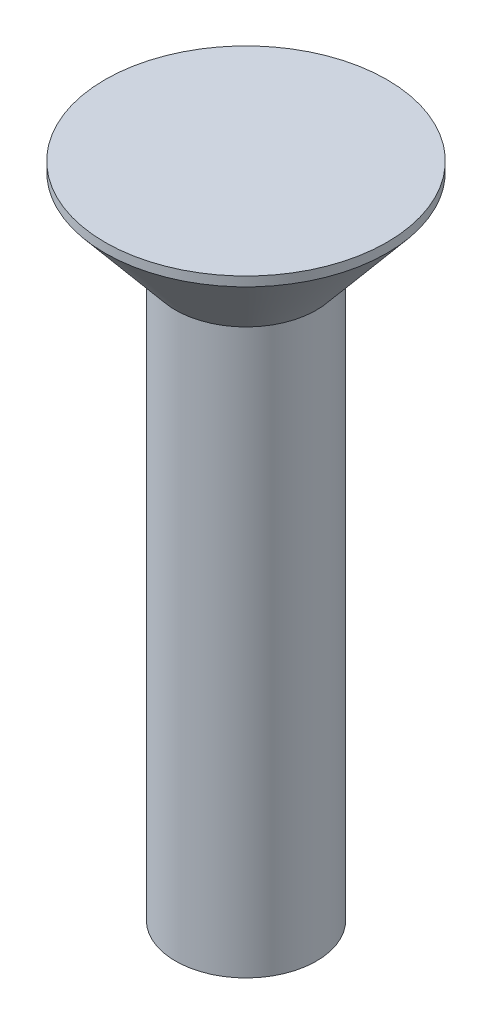
ISO-10303-21;
HEADER;
FILE_DESCRIPTION(('STEP AP214'),'2;1');
FILE_NAME('part.step','',(''),(''),'','','');
FILE_SCHEMA(('AUTOMOTIVE_DESIGN { 1 0 10303 214 1 1 1 1 }'));
ENDSEC;
DATA;
#1=APPLICATION_CONTEXT('core data for automotive mechanical design processes');
#2=APPLICATION_PROTOCOL_DEFINITION('international standard','automotive_design',2000,#1);
#3=PRODUCT_CONTEXT('',#1,'mechanical');
#4=PRODUCT('Part','Part','',(#3));
#5=PRODUCT_RELATED_PRODUCT_CATEGORY('part','',(#4));
#6=PRODUCT_DEFINITION_FORMATION('','',#4);
#7=PRODUCT_DEFINITION_CONTEXT('part definition',#1,'design');
#8=PRODUCT_DEFINITION('design','',#6,#7);
#9=PRODUCT_DEFINITION_SHAPE('','',#8);
#10=(LENGTH_UNIT() NAMED_UNIT(*) SI_UNIT(.MILLI.,.METRE.));
#11=(NAMED_UNIT(*) PLANE_ANGLE_UNIT() SI_UNIT($,.RADIAN.));
#12=(NAMED_UNIT(*) SI_UNIT($,.STERADIAN.) SOLID_ANGLE_UNIT());
#13=UNCERTAINTY_MEASURE_WITH_UNIT(LENGTH_MEASURE(1.E-05),#10,'distance_accuracy_value','');
#14=(GEOMETRIC_REPRESENTATION_CONTEXT(3) GLOBAL_UNCERTAINTY_ASSIGNED_CONTEXT((#13)) GLOBAL_UNIT_ASSIGNED_CONTEXT((#10,
#11,#12)) REPRESENTATION_CONTEXT('',''));
#15=CARTESIAN_POINT('',(0.,0.,0.));
#16=DIRECTION('',(0.,0.,1.));
#17=DIRECTION('',(1.,0.,0.));
#18=AXIS2_PLACEMENT_3D('',#15,#16,#17);
#19=CARTESIAN_POINT('',(0.,0.,0.));
#20=DIRECTION('',(0.,1.,0.));
#21=DIRECTION('',(0.,0.,1.));
#22=AXIS2_PLACEMENT_3D('',#19,#20,#21);
#23=PLANE('',#22);
#24=CARTESIAN_POINT('',(0.,0.,0.));
#25=DIRECTION('',(0.,-1.,0.));
#26=DIRECTION('',(0.,0.,-1.));
#27=AXIS2_PLACEMENT_3D('',#24,#25,#26);
#28=CIRCLE('',#27,3.);
#29=CARTESIAN_POINT('',(0.,0.,-3.));
#30=VERTEX_POINT('',#29);
#31=EDGE_CURVE('E10',#30,#30,#28,.T.);
#32=ORIENTED_EDGE('',*,*,#31,.F.);
#33=EDGE_LOOP('',(#32));
#34=FACE_BOUND('',#33,.T.);
#35=ADVANCED_FACE('F32',(#34),#23,.T.);
#36=CARTESIAN_POINT('',(0.,-14.,0.));
#37=DIRECTION('',(0.,-1.,0.));
#38=DIRECTION('',(0.,0.,-1.));
#39=AXIS2_PLACEMENT_3D('',#36,#37,#38);
#40=CYLINDRICAL_SURFACE('',#39,3.);
#41=ORIENTED_EDGE('',*,*,#31,.T.);
#42=EDGE_LOOP('',(#41));
#43=FACE_BOUND('',#42,.T.);
#44=CARTESIAN_POINT('',(0.,-0.200000000000001,0.));
#45=DIRECTION('',(0.,-1.,0.));
#46=DIRECTION('',(0.,0.,-1.));
#47=AXIS2_PLACEMENT_3D('',#44,#45,#46);
#48=CIRCLE('',#47,3.);
#49=CARTESIAN_POINT('',(0.,-0.200000000000001,-3.));
#50=VERTEX_POINT('',#49);
#51=EDGE_CURVE('E38',#50,#50,#48,.T.);
#52=ORIENTED_EDGE('',*,*,#51,.F.);
#53=EDGE_LOOP('',(#52));
#54=FACE_BOUND('',#53,.T.);
#55=ADVANCED_FACE('F64',(#43,#54),#40,.T.);
#56=CARTESIAN_POINT('',(0.,-2.,0.));
#57=DIRECTION('',(0.,1.,0.));
#58=DIRECTION('',(0.,0.,1.));
#59=AXIS2_PLACEMENT_3D('',#56,#57,#58);
#60=CONICAL_SURFACE('',#59,1.5,0.694738276196703);
#61=ORIENTED_EDGE('',*,*,#51,.T.);
#62=EDGE_LOOP('',(#61));
#63=FACE_BOUND('',#62,.T.);
#64=CARTESIAN_POINT('',(0.,-2.,0.));
#65=DIRECTION('',(0.,-1.,0.));
#66=DIRECTION('',(0.,0.,-1.));
#67=AXIS2_PLACEMENT_3D('',#64,#65,#66);
#68=CIRCLE('',#67,1.5);
#69=CARTESIAN_POINT('',(0.,-2.,-1.5));
#70=VERTEX_POINT('',#69);
#71=EDGE_CURVE('E42',#70,#70,#68,.T.);
#72=ORIENTED_EDGE('',*,*,#71,.F.);
#73=EDGE_LOOP('',(#72));
#74=FACE_BOUND('',#73,.T.);
#75=ADVANCED_FACE('F56',(#63,#74),#60,.T.);
#76=CARTESIAN_POINT('',(0.,-14.,0.));
#77=DIRECTION('',(0.,-1.,0.));
#78=DIRECTION('',(0.,0.,-1.));
#79=AXIS2_PLACEMENT_3D('',#76,#77,#78);
#80=CYLINDRICAL_SURFACE('',#79,1.5);
#81=ORIENTED_EDGE('',*,*,#71,.T.);
#82=EDGE_LOOP('',(#81));
#83=FACE_BOUND('',#82,.T.);
#84=CARTESIAN_POINT('',(0.,-14.,0.));
#85=DIRECTION('',(0.,-1.,0.));
#86=DIRECTION('',(0.,0.,-1.));
#87=AXIS2_PLACEMENT_3D('',#84,#85,#86);
#88=CIRCLE('',#87,1.5);
#89=CARTESIAN_POINT('',(0.,-14.,-1.5));
#90=VERTEX_POINT('',#89);
#91=EDGE_CURVE('E46',#90,#90,#88,.T.);
#92=ORIENTED_EDGE('',*,*,#91,.F.);
#93=EDGE_LOOP('',(#92));
#94=FACE_BOUND('',#93,.T.);
#95=ADVANCED_FACE('F54',(#83,#94),#80,.T.);
#96=CARTESIAN_POINT('',(1.5,-14.,0.));
#97=DIRECTION('',(0.,-1.,0.));
#98=DIRECTION('',(0.,0.,-1.));
#99=AXIS2_PLACEMENT_3D('',#96,#97,#98);
#100=PLANE('',#99);
#101=ORIENTED_EDGE('',*,*,#91,.T.);
#102=EDGE_LOOP('',(#101));
#103=FACE_BOUND('',#102,.T.);
#104=ADVANCED_FACE('F52',(#103),#100,.T.);
#105=CLOSED_SHELL('',(#35,#55,#75,#95,#104));
#106=MANIFOLD_SOLID_BREP('B2',#105);
#107=ADVANCED_BREP_SHAPE_REPRESENTATION('',(#18,#106),#14);
#108=SHAPE_DEFINITION_REPRESENTATION(#9,#107);
ENDSEC;
END-ISO-10303-21;
